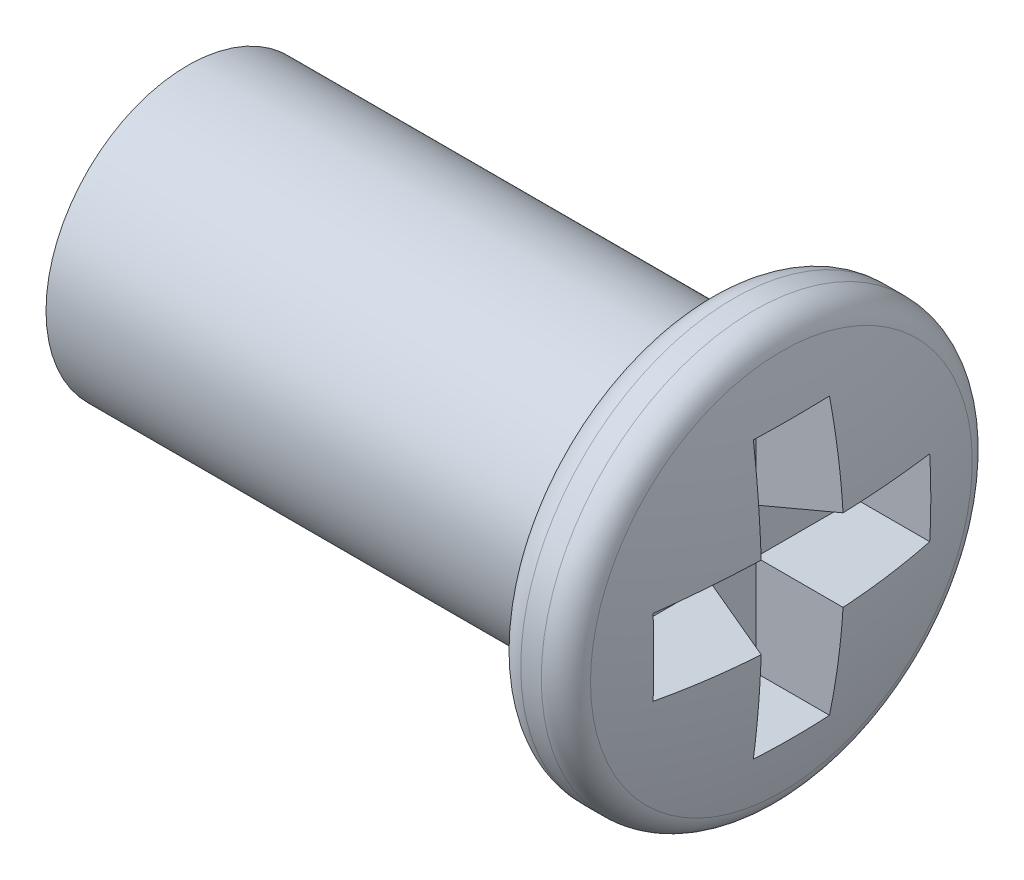
ISO-10303-21;
HEADER;
FILE_DESCRIPTION(('STEP AP214'),'2;1');
FILE_NAME('part.step','',(''),(''),'','','');
FILE_SCHEMA(('AUTOMOTIVE_DESIGN { 1 0 10303 214 1 1 1 1 }'));
ENDSEC;
DATA;
#1=APPLICATION_CONTEXT('core data for automotive mechanical design processes');
#2=APPLICATION_PROTOCOL_DEFINITION('international standard','automotive_design',2000,#1);
#3=PRODUCT_CONTEXT('',#1,'mechanical');
#4=PRODUCT('Part','Part','',(#3));
#5=PRODUCT_RELATED_PRODUCT_CATEGORY('part','',(#4));
#6=PRODUCT_DEFINITION_FORMATION('','',#4);
#7=PRODUCT_DEFINITION_CONTEXT('part definition',#1,'design');
#8=PRODUCT_DEFINITION('design','',#6,#7);
#9=PRODUCT_DEFINITION_SHAPE('','',#8);
#10=(LENGTH_UNIT() NAMED_UNIT(*) SI_UNIT(.MILLI.,.METRE.));
#11=(NAMED_UNIT(*) PLANE_ANGLE_UNIT() SI_UNIT($,.RADIAN.));
#12=(NAMED_UNIT(*) SI_UNIT($,.STERADIAN.) SOLID_ANGLE_UNIT());
#13=UNCERTAINTY_MEASURE_WITH_UNIT(LENGTH_MEASURE(1.E-05),#10,'distance_accuracy_value','');
#14=(GEOMETRIC_REPRESENTATION_CONTEXT(3) GLOBAL_UNCERTAINTY_ASSIGNED_CONTEXT((#13)) GLOBAL_UNIT_ASSIGNED_CONTEXT((#10,
#11,#12)) REPRESENTATION_CONTEXT('',''));
#15=CARTESIAN_POINT('',(0.,0.,0.));
#16=DIRECTION('',(0.,0.,1.));
#17=DIRECTION('',(1.,0.,0.));
#18=AXIS2_PLACEMENT_3D('',#15,#16,#17);
#19=CARTESIAN_POINT('',(0.,1.,0.));
#20=DIRECTION('',(1.,0.,0.));
#21=DIRECTION('',(0.,0.,-1.));
#22=AXIS2_PLACEMENT_3D('',#19,#20,#21);
#23=PLANE('',#22);
#24=CARTESIAN_POINT('',(0.,0.,0.));
#25=DIRECTION('',(-1.,0.,0.));
#26=DIRECTION('',(0.,0.,1.));
#27=AXIS2_PLACEMENT_3D('',#24,#25,#26);
#28=CIRCLE('',#27,1.);
#29=CARTESIAN_POINT('',(0.,0.,1.));
#30=VERTEX_POINT('',#29);
#31=EDGE_CURVE('E136',#30,#30,#28,.T.);
#32=ORIENTED_EDGE('',*,*,#31,.T.);
#33=EDGE_LOOP('',(#32));
#34=FACE_BOUND('',#33,.T.);
#35=ADVANCED_FACE('F41',(#34),#23,.F.);
#36=CARTESIAN_POINT('',(-1.37499999999998,0.,0.));
#37=DIRECTION('',(-1.,0.,0.));
#38=DIRECTION('',(0.,1.,0.));
#39=AXIS2_PLACEMENT_3D('',#36,#37,#38);
#40=SPHERICAL_SURFACE('',#39,5.72499999999998);
#41=CARTESIAN_POINT('',(-1.06468045079199,0.,-1.15812832422609));
#42=DIRECTION('',(-0.258819045102521,0.,0.965925826289068));
#43=DIRECTION('',(0.965925826289068,0.,0.258819045102521));
#44=AXIS2_PLACEMENT_3D('',#41,#42,#43);
#45=CIRCLE('',#44,5.59804122546489);
#46=CARTESIAN_POINT('',(4.33541058439024,0.288821707705538,0.288821707705538));
#47=VERTEX_POINT('',#46);
#48=CARTESIAN_POINT('',(4.25982365451314,0.975837321050407,0.268568250886621));
#49=VERTEX_POINT('',#48);
#50=EDGE_CURVE('E217',#47,#49,#45,.T.);
#51=ORIENTED_EDGE('',*,*,#50,.T.);
#52=CARTESIAN_POINT('',(-1.24149771833294,-0.49823729810778,0.));
#53=DIRECTION('',(-0.258819045102521,0.965925826289068,0.));
#54=DIRECTION('',(-0.965925826289068,-0.258819045102521,0.));
#55=AXIS2_PLACEMENT_3D('',#52,#53,#54);
#56=CIRCLE('',#55,5.70171568350823);
#57=CARTESIAN_POINT('',(4.25982365451314,0.975837321050407,-0.268568250886621));
#58=VERTEX_POINT('',#57);
#59=EDGE_CURVE('E11',#49,#58,#56,.T.);
#60=ORIENTED_EDGE('',*,*,#59,.T.);
#61=CARTESIAN_POINT('',(-1.06468045079199,0.,1.15812832422609));
#62=DIRECTION('',(-0.258819045102521,0.,-0.965925826289068));
#63=DIRECTION('',(-0.965925826289068,0.,0.258819045102521));
#64=AXIS2_PLACEMENT_3D('',#61,#62,#63);
#65=CIRCLE('',#64,5.59804122546489);
#66=CARTESIAN_POINT('',(4.33541058439024,0.288821707705538,-0.288821707705538));
#67=VERTEX_POINT('',#66);
#68=EDGE_CURVE('E50',#58,#67,#65,.T.);
#69=ORIENTED_EDGE('',*,*,#68,.T.);
#70=CARTESIAN_POINT('',(-1.06468045079199,-1.15812832422609,0.));
#71=DIRECTION('',(-0.258819045102521,0.965925826289068,0.));
#72=DIRECTION('',(-0.965925826289068,-0.258819045102521,0.));
#73=AXIS2_PLACEMENT_3D('',#70,#71,#72);
#74=CIRCLE('',#73,5.59804122546489);
#75=CARTESIAN_POINT('',(4.25982365451314,0.268568250886621,-0.975837321050407));
#76=VERTEX_POINT('',#75);
#77=EDGE_CURVE('E253',#67,#76,#74,.T.);
#78=ORIENTED_EDGE('',*,*,#77,.T.);
#79=CARTESIAN_POINT('',(-1.24149771833294,0.,0.49823729810778));
#80=DIRECTION('',(-0.258819045102521,0.,-0.965925826289068));
#81=DIRECTION('',(-0.965925826289068,0.,0.258819045102521));
#82=AXIS2_PLACEMENT_3D('',#79,#80,#81);
#83=CIRCLE('',#82,5.70171568350823);
#84=CARTESIAN_POINT('',(4.25982365451314,-0.268568250886622,-0.975837321050407));
#85=VERTEX_POINT('',#84);
#86=EDGE_CURVE('E249',#76,#85,#83,.T.);
#87=ORIENTED_EDGE('',*,*,#86,.T.);
#88=CARTESIAN_POINT('',(-1.06468045079199,1.15812832422609,0.));
#89=DIRECTION('',(-0.258819045102521,-0.965925826289068,0.));
#90=DIRECTION('',(0.965925826289068,-0.258819045102521,0.));
#91=AXIS2_PLACEMENT_3D('',#88,#89,#90);
#92=CIRCLE('',#91,5.59804122546489);
#93=CARTESIAN_POINT('',(4.33541058439024,-0.288821707705538,-0.288821707705538));
#94=VERTEX_POINT('',#93);
#95=EDGE_CURVE('E245',#85,#94,#92,.T.);
#96=ORIENTED_EDGE('',*,*,#95,.T.);
#97=CARTESIAN_POINT('',(-1.06468045079199,0.,1.15812832422609));
#98=DIRECTION('',(-0.258819045102521,0.,-0.965925826289068));
#99=DIRECTION('',(-0.965925826289068,0.,0.258819045102521));
#100=AXIS2_PLACEMENT_3D('',#97,#98,#99);
#101=CIRCLE('',#100,5.59804122546489);
#102=CARTESIAN_POINT('',(4.25982365451314,-0.975837321050406,-0.268568250886621));
#103=VERTEX_POINT('',#102);
#104=EDGE_CURVE('E241',#94,#103,#101,.T.);
#105=ORIENTED_EDGE('',*,*,#104,.T.);
#106=CARTESIAN_POINT('',(-1.24149771833294,0.49823729810778,0.));
#107=DIRECTION('',(-0.258819045102521,-0.965925826289068,0.));
#108=DIRECTION('',(0.965925826289068,-0.258819045102521,0.));
#109=AXIS2_PLACEMENT_3D('',#106,#107,#108);
#110=CIRCLE('',#109,5.70171568350823);
#111=CARTESIAN_POINT('',(4.25982365451314,-0.975837321050407,0.268568250886622));
#112=VERTEX_POINT('',#111);
#113=EDGE_CURVE('E237',#103,#112,#110,.T.);
#114=ORIENTED_EDGE('',*,*,#113,.T.);
#115=CARTESIAN_POINT('',(-1.06468045079199,0.,-1.15812832422609));
#116=DIRECTION('',(-0.258819045102521,0.,0.965925826289068));
#117=DIRECTION('',(0.965925826289068,0.,0.258819045102521));
#118=AXIS2_PLACEMENT_3D('',#115,#116,#117);
#119=CIRCLE('',#118,5.59804122546489);
#120=CARTESIAN_POINT('',(4.33541058439024,-0.288821707705538,0.288821707705539));
#121=VERTEX_POINT('',#120);
#122=EDGE_CURVE('E233',#112,#121,#119,.T.);
#123=ORIENTED_EDGE('',*,*,#122,.T.);
#124=CARTESIAN_POINT('',(-1.06468045079199,1.15812832422609,0.));
#125=DIRECTION('',(-0.258819045102521,-0.965925826289068,0.));
#126=DIRECTION('',(0.965925826289068,-0.258819045102521,0.));
#127=AXIS2_PLACEMENT_3D('',#124,#125,#126);
#128=CIRCLE('',#127,5.59804122546489);
#129=CARTESIAN_POINT('',(4.25982365451314,-0.268568250886621,0.975837321050407));
#130=VERTEX_POINT('',#129);
#131=EDGE_CURVE('E229',#121,#130,#128,.T.);
#132=ORIENTED_EDGE('',*,*,#131,.T.);
#133=CARTESIAN_POINT('',(-1.24149771833294,0.,-0.49823729810778));
#134=DIRECTION('',(-0.258819045102521,0.,0.965925826289068));
#135=DIRECTION('',(0.965925826289068,0.,0.258819045102521));
#136=AXIS2_PLACEMENT_3D('',#133,#134,#135);
#137=CIRCLE('',#136,5.70171568350823);
#138=CARTESIAN_POINT('',(4.25982365451314,0.268568250886622,0.975837321050407));
#139=VERTEX_POINT('',#138);
#140=EDGE_CURVE('E225',#130,#139,#137,.T.);
#141=ORIENTED_EDGE('',*,*,#140,.T.);
#142=CARTESIAN_POINT('',(-1.06468045079199,-1.15812832422609,0.));
#143=DIRECTION('',(-0.258819045102521,0.965925826289068,0.));
#144=DIRECTION('',(-0.965925826289068,-0.258819045102521,0.));
#145=AXIS2_PLACEMENT_3D('',#142,#143,#144);
#146=CIRCLE('',#145,5.59804122546489);
#147=EDGE_CURVE('E221',#139,#47,#146,.T.);
#148=ORIENTED_EDGE('',*,*,#147,.T.);
#149=EDGE_LOOP('',(#51,#60,#69,#78,#87,#96,#105,#114,#123,#132,#141,#148));
#150=FACE_BOUND('',#149,.T.);
#151=CARTESIAN_POINT('',(4.18926612644934,0.,0.));
#152=DIRECTION('',(-1.,0.,0.));
#153=DIRECTION('',(0.,0.,1.));
#154=AXIS2_PLACEMENT_3D('',#151,#152,#153);
#155=CIRCLE('',#154,1.34705882352941);
#156=CARTESIAN_POINT('',(4.18926612644934,0.,1.34705882352941));
#157=VERTEX_POINT('',#156);
#158=EDGE_CURVE('E213',#157,#157,#155,.F.);
#159=ORIENTED_EDGE('',*,*,#158,.T.);
#160=EDGE_LOOP('',(#159));
#161=FACE_BOUND('',#160,.T.);
#162=ADVANCED_FACE('F258',(#150,#161),#40,.T.);
#163=CARTESIAN_POINT('',(-102.038169229657,0.,0.));
#164=DIRECTION('',(-1.,0.,0.));
#165=DIRECTION('',(0.,0.,1.));
#166=AXIS2_PLACEMENT_3D('',#163,#164,#165);
#167=CYLINDRICAL_SURFACE('',#166,1.5);
#168=CARTESIAN_POINT('',(3.85000000000001,0.,0.));
#169=DIRECTION('',(1.,0.,0.));
#170=DIRECTION('',(0.,0.,-1.));
#171=AXIS2_PLACEMENT_3D('',#168,#169,#170);
#172=CIRCLE('',#171,1.5);
#173=CARTESIAN_POINT('',(3.85000000000001,0.,-1.5));
#174=VERTEX_POINT('',#173);
#175=EDGE_CURVE('E209',#174,#174,#172,.T.);
#176=ORIENTED_EDGE('',*,*,#175,.T.);
#177=EDGE_LOOP('',(#176));
#178=FACE_BOUND('',#177,.T.);
#179=CARTESIAN_POINT('',(3.99488128360394,0.,0.));
#180=DIRECTION('',(-1.,0.,0.));
#181=DIRECTION('',(0.,0.,1.));
#182=AXIS2_PLACEMENT_3D('',#179,#180,#181);
#183=CIRCLE('',#182,1.5);
#184=CARTESIAN_POINT('',(3.99488128360394,0.,1.5));
#185=VERTEX_POINT('',#184);
#186=EDGE_CURVE('E205',#185,#185,#183,.T.);
#187=ORIENTED_EDGE('',*,*,#186,.T.);
#188=EDGE_LOOP('',(#187));
#189=FACE_BOUND('',#188,.T.);
#190=ADVANCED_FACE('F338',(#178,#189),#167,.T.);
#191=CARTESIAN_POINT('',(3.65,1.5,0.));
#192=DIRECTION('',(1.,0.,0.));
#193=DIRECTION('',(0.,0.,-1.));
#194=AXIS2_PLACEMENT_3D('',#191,#192,#193);
#195=PLANE('',#194);
#196=CARTESIAN_POINT('',(3.65,0.,0.));
#197=DIRECTION('',(1.,0.,0.));
#198=DIRECTION('',(0.,0.,-1.));
#199=AXIS2_PLACEMENT_3D('',#196,#197,#198);
#200=CIRCLE('',#199,1.3);
#201=CARTESIAN_POINT('',(3.65,0.,-1.3));
#202=VERTEX_POINT('',#201);
#203=EDGE_CURVE('E201',#202,#202,#200,.F.);
#204=ORIENTED_EDGE('',*,*,#203,.T.);
#205=EDGE_LOOP('',(#204));
#206=FACE_BOUND('',#205,.T.);
#207=CARTESIAN_POINT('',(3.65,0.,0.));
#208=DIRECTION('',(-1.,0.,0.));
#209=DIRECTION('',(0.,0.,1.));
#210=AXIS2_PLACEMENT_3D('',#207,#208,#209);
#211=CIRCLE('',#210,1.);
#212=CARTESIAN_POINT('',(3.65,0.,1.));
#213=VERTEX_POINT('',#212);
#214=EDGE_CURVE('E197',#213,#213,#211,.T.);
#215=ORIENTED_EDGE('',*,*,#214,.F.);
#216=EDGE_LOOP('',(#215));
#217=FACE_BOUND('',#216,.T.);
#218=ADVANCED_FACE('F350',(#206,#217),#195,.F.);
#219=CARTESIAN_POINT('',(-102.038169229657,0.,0.));
#220=DIRECTION('',(-1.,0.,0.));
#221=DIRECTION('',(0.,0.,1.));
#222=AXIS2_PLACEMENT_3D('',#219,#220,#221);
#223=CYLINDRICAL_SURFACE('',#222,1.);
#224=ORIENTED_EDGE('',*,*,#31,.F.);
#225=EDGE_LOOP('',(#224));
#226=FACE_BOUND('',#225,.T.);
#227=ORIENTED_EDGE('',*,*,#214,.T.);
#228=EDGE_LOOP('',(#227));
#229=FACE_BOUND('',#228,.T.);
#230=ADVANCED_FACE('F343',(#226,#229),#223,.T.);
#231=CARTESIAN_POINT('',(3.85000000000001,0.,0.));
#232=DIRECTION('',(1.,0.,0.));
#233=DIRECTION('',(0.,0.,-1.));
#234=AXIS2_PLACEMENT_3D('',#231,#232,#233);
#235=TOROIDAL_SURFACE('',#234,1.3,0.2);
#236=ORIENTED_EDGE('',*,*,#175,.F.);
#237=EDGE_LOOP('',(#236));
#238=FACE_BOUND('',#237,.T.);
#239=ORIENTED_EDGE('',*,*,#203,.F.);
#240=EDGE_LOOP('',(#239));
#241=FACE_BOUND('',#240,.T.);
#242=ADVANCED_FACE('F341',(#238,#241),#235,.T.);
#243=CARTESIAN_POINT('',(3.99488128360395,0.,0.));
#244=DIRECTION('',(-1.,0.,0.));
#245=DIRECTION('',(0.,0.,1.));
#246=AXIS2_PLACEMENT_3D('',#243,#244,#245);
#247=TOROIDAL_SURFACE('',#246,1.3,0.2);
#248=ORIENTED_EDGE('',*,*,#158,.F.);
#249=EDGE_LOOP('',(#248));
#250=FACE_BOUND('',#249,.T.);
#251=ORIENTED_EDGE('',*,*,#186,.F.);
#252=EDGE_LOOP('',(#251));
#253=FACE_BOUND('',#252,.T.);
#254=ADVANCED_FACE('F43',(#250,#253),#247,.T.);
#255=CARTESIAN_POINT('',(4.35,1.,0.292730929836214));
#256=DIRECTION('',(-0.258819045102521,0.965925826289068,0.));
#257=DIRECTION('',(-0.965925826289068,-0.258819045102521,0.));
#258=AXIS2_PLACEMENT_3D('',#255,#256,#257);
#259=PLANE('',#258);
#260=DIRECTION('',(0.935113126531029,0.250562807085732,0.250562807085732));
#261=VECTOR('',#260,1.);
#262=CARTESIAN_POINT('',(4.35,1.,0.292730929836214));
#263=LINE('',#262,#261);
#264=CARTESIAN_POINT('',(3.85,0.866025403784438,0.158756333620653));
#265=VERTEX_POINT('',#264);
#266=EDGE_CURVE('E57',#265,#49,#263,.T.);
#267=ORIENTED_EDGE('',*,*,#266,.F.);
#268=DIRECTION('',(0.,0.,1.));
#269=VECTOR('',#268,1.);
#270=CARTESIAN_POINT('',(3.85,0.866025403784438,0.292730929836214));
#271=LINE('',#270,#269);
#272=CARTESIAN_POINT('',(3.85,0.866025403784438,-0.158756333620653));
#273=VERTEX_POINT('',#272);
#274=EDGE_CURVE('E140',#273,#265,#271,.T.);
#275=ORIENTED_EDGE('',*,*,#274,.F.);
#276=DIRECTION('',(0.935113126531029,0.250562807085732,-0.250562807085732));
#277=VECTOR('',#276,1.);
#278=CARTESIAN_POINT('',(4.35,1.,-0.292730929836215));
#279=LINE('',#278,#277);
#280=EDGE_CURVE('E129',#273,#58,#279,.T.);
#281=ORIENTED_EDGE('',*,*,#280,.T.);
#282=ORIENTED_EDGE('',*,*,#59,.F.);
#283=EDGE_LOOP('',(#267,#275,#281,#282));
#284=FACE_BOUND('',#283,.T.);
#285=ADVANCED_FACE('F141',(#284),#259,.F.);
#286=CARTESIAN_POINT('',(4.35,1.,-0.292730929836215));
#287=DIRECTION('',(-0.258819045102521,0.,-0.965925826289068));
#288=DIRECTION('',(-0.965925826289068,0.,0.258819045102521));
#289=AXIS2_PLACEMENT_3D('',#286,#287,#288);
#290=PLANE('',#289);
#291=ORIENTED_EDGE('',*,*,#280,.F.);
#292=DIRECTION('',(0.,1.,0.));
#293=VECTOR('',#292,1.);
#294=CARTESIAN_POINT('',(3.85,1.,-0.158756333620653));
#295=LINE('',#294,#293);
#296=CARTESIAN_POINT('',(3.85,0.158756333620653,-0.158756333620653));
#297=VERTEX_POINT('',#296);
#298=EDGE_CURVE('E133',#297,#273,#295,.T.);
#299=ORIENTED_EDGE('',*,*,#298,.F.);
#300=DIRECTION('',(0.935113126531029,0.250562807085732,-0.250562807085732));
#301=VECTOR('',#300,1.);
#302=CARTESIAN_POINT('',(4.51571637530692,0.337134498772317,-0.337134498772317));
#303=LINE('',#302,#301);
#304=EDGE_CURVE('E137',#297,#67,#303,.T.);
#305=ORIENTED_EDGE('',*,*,#304,.T.);
#306=ORIENTED_EDGE('',*,*,#68,.F.);
#307=EDGE_LOOP('',(#291,#299,#305,#306));
#308=FACE_BOUND('',#307,.T.);
#309=ADVANCED_FACE('F131',(#308),#290,.F.);
#310=CARTESIAN_POINT('',(4.35,0.292730929836215,-0.292730929836214));
#311=DIRECTION('',(-0.258819045102521,0.965925826289068,0.));
#312=DIRECTION('',(-0.965925826289068,-0.258819045102521,0.));
#313=AXIS2_PLACEMENT_3D('',#310,#311,#312);
#314=PLANE('',#313);
#315=ORIENTED_EDGE('',*,*,#304,.F.);
#316=DIRECTION('',(0.,0.,1.));
#317=VECTOR('',#316,1.);
#318=CARTESIAN_POINT('',(3.85,0.158756333620653,-0.292730929836214));
#319=LINE('',#318,#317);
#320=CARTESIAN_POINT('',(3.85,0.158756333620653,-0.866025403784438));
#321=VERTEX_POINT('',#320);
#322=EDGE_CURVE('E151',#321,#297,#319,.T.);
#323=ORIENTED_EDGE('',*,*,#322,.F.);
#324=DIRECTION('',(0.935113126531029,0.250562807085732,-0.250562807085732));
#325=VECTOR('',#324,1.);
#326=CARTESIAN_POINT('',(4.35,0.292730929836215,-1.));
#327=LINE('',#326,#325);
#328=EDGE_CURVE('E296',#321,#76,#327,.T.);
#329=ORIENTED_EDGE('',*,*,#328,.T.);
#330=ORIENTED_EDGE('',*,*,#77,.F.);
#331=EDGE_LOOP('',(#315,#323,#329,#330));
#332=FACE_BOUND('',#331,.T.);
#333=ADVANCED_FACE('F302',(#332),#314,.F.);
#334=CARTESIAN_POINT('',(4.35,0.292730929836215,-1.));
#335=DIRECTION('',(-0.258819045102521,0.,-0.965925826289068));
#336=DIRECTION('',(-0.965925826289068,0.,0.258819045102521));
#337=AXIS2_PLACEMENT_3D('',#334,#335,#336);
#338=PLANE('',#337);
#339=ORIENTED_EDGE('',*,*,#328,.F.);
#340=DIRECTION('',(0.,1.,0.));
#341=VECTOR('',#340,1.);
#342=CARTESIAN_POINT('',(3.85,0.292730929836215,-0.866025403784438));
#343=LINE('',#342,#341);
#344=CARTESIAN_POINT('',(3.85,-0.158756333620653,-0.866025403784438));
#345=VERTEX_POINT('',#344);
#346=EDGE_CURVE('E158',#345,#321,#343,.T.);
#347=ORIENTED_EDGE('',*,*,#346,.F.);
#348=DIRECTION('',(0.935113126531029,-0.250562807085732,-0.250562807085732));
#349=VECTOR('',#348,1.);
#350=CARTESIAN_POINT('',(4.35,-0.292730929836214,-1.));
#351=LINE('',#350,#349);
#352=EDGE_CURVE('E292',#345,#85,#351,.T.);
#353=ORIENTED_EDGE('',*,*,#352,.T.);
#354=ORIENTED_EDGE('',*,*,#86,.F.);
#355=EDGE_LOOP('',(#339,#347,#353,#354));
#356=FACE_BOUND('',#355,.T.);
#357=ADVANCED_FACE('F305',(#356),#338,.F.);
#358=CARTESIAN_POINT('',(4.35,-0.292730929836214,-1.));
#359=DIRECTION('',(-0.258819045102521,-0.965925826289068,0.));
#360=DIRECTION('',(0.965925826289068,-0.258819045102521,0.));
#361=AXIS2_PLACEMENT_3D('',#358,#359,#360);
#362=PLANE('',#361);
#363=ORIENTED_EDGE('',*,*,#352,.F.);
#364=DIRECTION('',(0.,0.,-1.));
#365=VECTOR('',#364,1.);
#366=CARTESIAN_POINT('',(3.85,-0.158756333620653,-1.));
#367=LINE('',#366,#365);
#368=CARTESIAN_POINT('',(3.85,-0.158756333620653,-0.158756333620653));
#369=VERTEX_POINT('',#368);
#370=EDGE_CURVE('E164',#369,#345,#367,.T.);
#371=ORIENTED_EDGE('',*,*,#370,.F.);
#372=DIRECTION('',(0.935113126531029,-0.250562807085732,-0.250562807085732));
#373=VECTOR('',#372,1.);
#374=CARTESIAN_POINT('',(4.51571637530692,-0.337134498772317,-0.337134498772317));
#375=LINE('',#374,#373);
#376=EDGE_CURVE('E288',#369,#94,#375,.T.);
#377=ORIENTED_EDGE('',*,*,#376,.T.);
#378=ORIENTED_EDGE('',*,*,#95,.F.);
#379=EDGE_LOOP('',(#363,#371,#377,#378));
#380=FACE_BOUND('',#379,.T.);
#381=ADVANCED_FACE('F307',(#380),#362,.F.);
#382=CARTESIAN_POINT('',(4.35,-0.292730929836215,-0.292730929836214));
#383=DIRECTION('',(-0.258819045102521,0.,-0.965925826289068));
#384=DIRECTION('',(-0.965925826289068,0.,0.258819045102521));
#385=AXIS2_PLACEMENT_3D('',#382,#383,#384);
#386=PLANE('',#385);
#387=ORIENTED_EDGE('',*,*,#376,.F.);
#388=DIRECTION('',(0.,1.,0.));
#389=VECTOR('',#388,1.);
#390=CARTESIAN_POINT('',(3.85,-0.292730929836215,-0.158756333620653));
#391=LINE('',#390,#389);
#392=CARTESIAN_POINT('',(3.85,-0.866025403784438,-0.158756333620653));
#393=VERTEX_POINT('',#392);
#394=EDGE_CURVE('E168',#393,#369,#391,.T.);
#395=ORIENTED_EDGE('',*,*,#394,.F.);
#396=DIRECTION('',(0.935113126531029,-0.250562807085732,-0.250562807085732));
#397=VECTOR('',#396,1.);
#398=CARTESIAN_POINT('',(4.35,-1.,-0.292730929836215));
#399=LINE('',#398,#397);
#400=EDGE_CURVE('E284',#393,#103,#399,.T.);
#401=ORIENTED_EDGE('',*,*,#400,.T.);
#402=ORIENTED_EDGE('',*,*,#104,.F.);
#403=EDGE_LOOP('',(#387,#395,#401,#402));
#404=FACE_BOUND('',#403,.T.);
#405=ADVANCED_FACE('F311',(#404),#386,.F.);
#406=CARTESIAN_POINT('',(4.35,-1.,-0.292730929836215));
#407=DIRECTION('',(-0.258819045102521,-0.965925826289068,0.));
#408=DIRECTION('',(0.965925826289068,-0.258819045102521,0.));
#409=AXIS2_PLACEMENT_3D('',#406,#407,#408);
#410=PLANE('',#409);
#411=ORIENTED_EDGE('',*,*,#400,.F.);
#412=DIRECTION('',(0.,0.,-1.));
#413=VECTOR('',#412,1.);
#414=CARTESIAN_POINT('',(3.85,-0.866025403784438,-0.292730929836215));
#415=LINE('',#414,#413);
#416=CARTESIAN_POINT('',(3.85,-0.866025403784438,0.158756333620653));
#417=VERTEX_POINT('',#416);
#418=EDGE_CURVE('E172',#417,#393,#415,.T.);
#419=ORIENTED_EDGE('',*,*,#418,.F.);
#420=DIRECTION('',(0.935113126531029,-0.250562807085732,0.250562807085732));
#421=VECTOR('',#420,1.);
#422=CARTESIAN_POINT('',(4.35,-1.,0.292730929836214));
#423=LINE('',#422,#421);
#424=EDGE_CURVE('E280',#417,#112,#423,.T.);
#425=ORIENTED_EDGE('',*,*,#424,.T.);
#426=ORIENTED_EDGE('',*,*,#113,.F.);
#427=EDGE_LOOP('',(#411,#419,#425,#426));
#428=FACE_BOUND('',#427,.T.);
#429=ADVANCED_FACE('F314',(#428),#410,.F.);
#430=CARTESIAN_POINT('',(4.35,-1.,0.292730929836214));
#431=DIRECTION('',(-0.258819045102521,0.,0.965925826289068));
#432=DIRECTION('',(0.965925826289068,0.,0.258819045102521));
#433=AXIS2_PLACEMENT_3D('',#430,#431,#432);
#434=PLANE('',#433);
#435=ORIENTED_EDGE('',*,*,#424,.F.);
#436=DIRECTION('',(0.,-1.,0.));
#437=VECTOR('',#436,1.);
#438=CARTESIAN_POINT('',(3.85,-1.,0.158756333620653));
#439=LINE('',#438,#437);
#440=CARTESIAN_POINT('',(3.85,-0.158756333620653,0.158756333620653));
#441=VERTEX_POINT('',#440);
#442=EDGE_CURVE('E176',#441,#417,#439,.T.);
#443=ORIENTED_EDGE('',*,*,#442,.F.);
#444=DIRECTION('',(0.935113126531029,-0.250562807085732,0.250562807085732));
#445=VECTOR('',#444,1.);
#446=CARTESIAN_POINT('',(4.51571637530692,-0.337134498772317,0.337134498772317));
#447=LINE('',#446,#445);
#448=EDGE_CURVE('E276',#441,#121,#447,.T.);
#449=ORIENTED_EDGE('',*,*,#448,.T.);
#450=ORIENTED_EDGE('',*,*,#122,.F.);
#451=EDGE_LOOP('',(#435,#443,#449,#450));
#452=FACE_BOUND('',#451,.T.);
#453=ADVANCED_FACE('F316',(#452),#434,.F.);
#454=CARTESIAN_POINT('',(4.35,-0.292730929836214,0.292730929836214));
#455=DIRECTION('',(-0.258819045102521,-0.965925826289068,0.));
#456=DIRECTION('',(0.965925826289068,-0.258819045102521,0.));
#457=AXIS2_PLACEMENT_3D('',#454,#455,#456);
#458=PLANE('',#457);
#459=ORIENTED_EDGE('',*,*,#448,.F.);
#460=DIRECTION('',(0.,0.,-1.));
#461=VECTOR('',#460,1.);
#462=CARTESIAN_POINT('',(3.85,-0.158756333620653,0.292730929836214));
#463=LINE('',#462,#461);
#464=CARTESIAN_POINT('',(3.85,-0.158756333620653,0.866025403784438));
#465=VERTEX_POINT('',#464);
#466=EDGE_CURVE('E180',#465,#441,#463,.T.);
#467=ORIENTED_EDGE('',*,*,#466,.F.);
#468=DIRECTION('',(0.935113126531029,-0.250562807085732,0.250562807085732));
#469=VECTOR('',#468,1.);
#470=CARTESIAN_POINT('',(4.35,-0.292730929836214,1.));
#471=LINE('',#470,#469);
#472=EDGE_CURVE('E270',#465,#130,#471,.T.);
#473=ORIENTED_EDGE('',*,*,#472,.T.);
#474=ORIENTED_EDGE('',*,*,#131,.F.);
#475=EDGE_LOOP('',(#459,#467,#473,#474));
#476=FACE_BOUND('',#475,.T.);
#477=ADVANCED_FACE('F320',(#476),#458,.F.);
#478=CARTESIAN_POINT('',(4.35,-0.292730929836214,1.));
#479=DIRECTION('',(-0.258819045102521,0.,0.965925826289068));
#480=DIRECTION('',(0.965925826289068,0.,0.258819045102521));
#481=AXIS2_PLACEMENT_3D('',#478,#479,#480);
#482=PLANE('',#481);
#483=ORIENTED_EDGE('',*,*,#472,.F.);
#484=DIRECTION('',(0.,-1.,0.));
#485=VECTOR('',#484,1.);
#486=CARTESIAN_POINT('',(3.85,-0.292730929836214,0.866025403784438));
#487=LINE('',#486,#485);
#488=CARTESIAN_POINT('',(3.85,0.158756333620653,0.866025403784438));
#489=VERTEX_POINT('',#488);
#490=EDGE_CURVE('E184',#489,#465,#487,.T.);
#491=ORIENTED_EDGE('',*,*,#490,.F.);
#492=DIRECTION('',(0.935113126531029,0.250562807085732,0.250562807085732));
#493=VECTOR('',#492,1.);
#494=CARTESIAN_POINT('',(4.35,0.292730929836215,1.));
#495=LINE('',#494,#493);
#496=EDGE_CURVE('E267',#489,#139,#495,.T.);
#497=ORIENTED_EDGE('',*,*,#496,.T.);
#498=ORIENTED_EDGE('',*,*,#140,.F.);
#499=EDGE_LOOP('',(#483,#491,#497,#498));
#500=FACE_BOUND('',#499,.T.);
#501=ADVANCED_FACE('F323',(#500),#482,.F.);
#502=CARTESIAN_POINT('',(4.35,0.292730929836215,1.));
#503=DIRECTION('',(-0.258819045102521,0.965925826289068,0.));
#504=DIRECTION('',(-0.965925826289068,-0.258819045102521,0.));
#505=AXIS2_PLACEMENT_3D('',#502,#503,#504);
#506=PLANE('',#505);
#507=ORIENTED_EDGE('',*,*,#496,.F.);
#508=DIRECTION('',(0.,0.,1.));
#509=VECTOR('',#508,1.);
#510=CARTESIAN_POINT('',(3.85,0.158756333620653,1.));
#511=LINE('',#510,#509);
#512=CARTESIAN_POINT('',(3.85,0.158756333620653,0.158756333620653));
#513=VERTEX_POINT('',#512);
#514=EDGE_CURVE('E188',#513,#489,#511,.T.);
#515=ORIENTED_EDGE('',*,*,#514,.F.);
#516=DIRECTION('',(0.935113126531029,0.250562807085732,0.250562807085732));
#517=VECTOR('',#516,1.);
#518=CARTESIAN_POINT('',(4.51571637530692,0.337134498772317,0.337134498772317));
#519=LINE('',#518,#517);
#520=EDGE_CURVE('E156',#513,#47,#519,.T.);
#521=ORIENTED_EDGE('',*,*,#520,.T.);
#522=ORIENTED_EDGE('',*,*,#147,.F.);
#523=EDGE_LOOP('',(#507,#515,#521,#522));
#524=FACE_BOUND('',#523,.T.);
#525=ADVANCED_FACE('F264',(#524),#506,.F.);
#526=CARTESIAN_POINT('',(4.35,0.292730929836215,0.292730929836214));
#527=DIRECTION('',(-0.258819045102521,0.,0.965925826289068));
#528=DIRECTION('',(0.965925826289068,0.,0.258819045102521));
#529=AXIS2_PLACEMENT_3D('',#526,#527,#528);
#530=PLANE('',#529);
#531=ORIENTED_EDGE('',*,*,#520,.F.);
#532=DIRECTION('',(0.,-1.,0.));
#533=VECTOR('',#532,1.);
#534=CARTESIAN_POINT('',(3.85,0.292730929836215,0.158756333620653));
#535=LINE('',#534,#533);
#536=EDGE_CURVE('E145',#265,#513,#535,.T.);
#537=ORIENTED_EDGE('',*,*,#536,.F.);
#538=ORIENTED_EDGE('',*,*,#266,.T.);
#539=ORIENTED_EDGE('',*,*,#50,.F.);
#540=EDGE_LOOP('',(#531,#537,#538,#539));
#541=FACE_BOUND('',#540,.T.);
#542=ADVANCED_FACE('F261',(#541),#530,.F.);
#543=CARTESIAN_POINT('',(3.85,0.,0.));
#544=DIRECTION('',(-1.,0.,0.));
#545=DIRECTION('',(0.,0.,1.));
#546=AXIS2_PLACEMENT_3D('',#543,#544,#545);
#547=PLANE('',#546);
#548=ORIENTED_EDGE('',*,*,#274,.T.);
#549=ORIENTED_EDGE('',*,*,#536,.T.);
#550=ORIENTED_EDGE('',*,*,#514,.T.);
#551=ORIENTED_EDGE('',*,*,#490,.T.);
#552=ORIENTED_EDGE('',*,*,#466,.T.);
#553=ORIENTED_EDGE('',*,*,#442,.T.);
#554=ORIENTED_EDGE('',*,*,#418,.T.);
#555=ORIENTED_EDGE('',*,*,#394,.T.);
#556=ORIENTED_EDGE('',*,*,#370,.T.);
#557=ORIENTED_EDGE('',*,*,#346,.T.);
#558=ORIENTED_EDGE('',*,*,#322,.T.);
#559=ORIENTED_EDGE('',*,*,#298,.T.);
#560=EDGE_LOOP('',(#548,#549,#550,#551,#552,#553,#554,#555,#556,#557,#558,#559));
#561=FACE_BOUND('',#560,.T.);
#562=ADVANCED_FACE('F148',(#561),#547,.F.);
#563=CLOSED_SHELL('',(#35,#162,#190,#218,#230,#242,#254,#285,#309,#333,#357,#381,#405,#429,#453,
#477,#501,#525,#542,#562));
#564=MANIFOLD_SOLID_BREP('B2',#563);
#565=ADVANCED_BREP_SHAPE_REPRESENTATION('',(#18,#564),#14);
#566=SHAPE_DEFINITION_REPRESENTATION(#9,#565);
ENDSEC;
END-ISO-10303-21;
